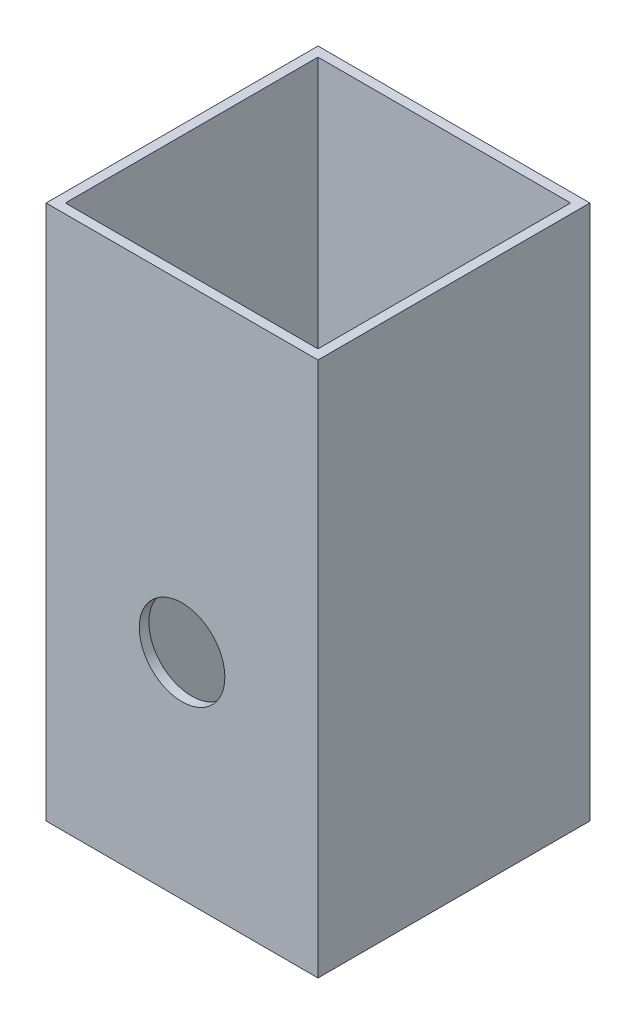
ISO-10303-21;
HEADER;
FILE_DESCRIPTION(('STEP AP214'),'2;1');
FILE_NAME('part.step','',(''),(''),'','','');
FILE_SCHEMA(('AUTOMOTIVE_DESIGN { 1 0 10303 214 1 1 1 1 }'));
ENDSEC;
DATA;
#1=APPLICATION_CONTEXT('core data for automotive mechanical design processes');
#2=APPLICATION_PROTOCOL_DEFINITION('international standard','automotive_design',2000,#1);
#3=PRODUCT_CONTEXT('',#1,'mechanical');
#4=PRODUCT('Part','Part','',(#3));
#5=PRODUCT_RELATED_PRODUCT_CATEGORY('part','',(#4));
#6=PRODUCT_DEFINITION_FORMATION('','',#4);
#7=PRODUCT_DEFINITION_CONTEXT('part definition',#1,'design');
#8=PRODUCT_DEFINITION('design','',#6,#7);
#9=PRODUCT_DEFINITION_SHAPE('','',#8);
#10=(LENGTH_UNIT() NAMED_UNIT(*) SI_UNIT(.MILLI.,.METRE.));
#11=(NAMED_UNIT(*) PLANE_ANGLE_UNIT() SI_UNIT($,.RADIAN.));
#12=(NAMED_UNIT(*) SI_UNIT($,.STERADIAN.) SOLID_ANGLE_UNIT());
#13=UNCERTAINTY_MEASURE_WITH_UNIT(LENGTH_MEASURE(1.E-05),#10,'distance_accuracy_value','');
#14=(GEOMETRIC_REPRESENTATION_CONTEXT(3) GLOBAL_UNCERTAINTY_ASSIGNED_CONTEXT((#13)) GLOBAL_UNIT_ASSIGNED_CONTEXT((#10,
#11,#12)) REPRESENTATION_CONTEXT('',''));
#15=CARTESIAN_POINT('',(0.,0.,0.));
#16=DIRECTION('',(0.,0.,1.));
#17=DIRECTION('',(1.,0.,0.));
#18=AXIS2_PLACEMENT_3D('',#15,#16,#17);
#19=CARTESIAN_POINT('',(0.,50.,0.));
#20=DIRECTION('',(0.,1.,0.));
#21=DIRECTION('',(0.,0.,1.));
#22=AXIS2_PLACEMENT_3D('',#19,#20,#21);
#23=PLANE('',#22);
#24=DIRECTION('',(0.,0.,-1.));
#25=VECTOR('',#24,1.);
#26=CARTESIAN_POINT('',(12.7,50.,-12.7));
#27=LINE('',#26,#25);
#28=CARTESIAN_POINT('',(12.7,50.,12.7));
#29=VERTEX_POINT('',#28);
#30=CARTESIAN_POINT('',(12.7,50.,-12.7));
#31=VERTEX_POINT('',#30);
#32=EDGE_CURVE('E160',#29,#31,#27,.T.);
#33=ORIENTED_EDGE('',*,*,#32,.T.);
#34=DIRECTION('',(-1.,0.,0.));
#35=VECTOR('',#34,1.);
#36=CARTESIAN_POINT('',(-12.7,50.,-12.7));
#37=LINE('',#36,#35);
#38=CARTESIAN_POINT('',(-12.7,50.,-12.7));
#39=VERTEX_POINT('',#38);
#40=EDGE_CURVE('E164',#31,#39,#37,.T.);
#41=ORIENTED_EDGE('',*,*,#40,.T.);
#42=DIRECTION('',(0.,0.,1.));
#43=VECTOR('',#42,1.);
#44=CARTESIAN_POINT('',(-12.7,50.,-12.7));
#45=LINE('',#44,#43);
#46=CARTESIAN_POINT('',(-12.7,50.,12.7));
#47=VERTEX_POINT('',#46);
#48=EDGE_CURVE('E168',#39,#47,#45,.T.);
#49=ORIENTED_EDGE('',*,*,#48,.T.);
#50=DIRECTION('',(1.,0.,0.));
#51=VECTOR('',#50,1.);
#52=CARTESIAN_POINT('',(-12.7,50.,12.7));
#53=LINE('',#52,#51);
#54=EDGE_CURVE('E171',#47,#29,#53,.T.);
#55=ORIENTED_EDGE('',*,*,#54,.T.);
#56=EDGE_LOOP('',(#33,#41,#49,#55));
#57=FACE_BOUND('',#56,.T.);
#58=DIRECTION('',(0.,0.,1.));
#59=VECTOR('',#58,1.);
#60=CARTESIAN_POINT('',(-11.8,50.,-11.8));
#61=LINE('',#60,#59);
#62=CARTESIAN_POINT('',(-11.8,50.,-11.8));
#63=VERTEX_POINT('',#62);
#64=CARTESIAN_POINT('',(-11.8,50.,11.8));
#65=VERTEX_POINT('',#64);
#66=EDGE_CURVE('E119',#63,#65,#61,.T.);
#67=ORIENTED_EDGE('',*,*,#66,.F.);
#68=DIRECTION('',(-1.,0.,0.));
#69=VECTOR('',#68,1.);
#70=CARTESIAN_POINT('',(-11.8,50.,-11.8));
#71=LINE('',#70,#69);
#72=CARTESIAN_POINT('',(11.8,50.,-11.8));
#73=VERTEX_POINT('',#72);
#74=EDGE_CURVE('E110',#73,#63,#71,.T.);
#75=ORIENTED_EDGE('',*,*,#74,.F.);
#76=DIRECTION('',(0.,0.,-1.));
#77=VECTOR('',#76,1.);
#78=CARTESIAN_POINT('',(11.8,50.,-11.8));
#79=LINE('',#78,#77);
#80=CARTESIAN_POINT('',(11.8,50.,11.8));
#81=VERTEX_POINT('',#80);
#82=EDGE_CURVE('E136',#81,#73,#79,.T.);
#83=ORIENTED_EDGE('',*,*,#82,.F.);
#84=DIRECTION('',(1.,0.,0.));
#85=VECTOR('',#84,1.);
#86=CARTESIAN_POINT('',(-11.8,50.,11.8));
#87=LINE('',#86,#85);
#88=EDGE_CURVE('E132',#65,#81,#87,.T.);
#89=ORIENTED_EDGE('',*,*,#88,.F.);
#90=EDGE_LOOP('',(#67,#75,#83,#89));
#91=FACE_BOUND('',#90,.T.);
#92=ADVANCED_FACE('F43',(#57,#91),#23,.T.);
#93=CARTESIAN_POINT('',(0.,0.,0.));
#94=DIRECTION('',(0.,1.,0.));
#95=DIRECTION('',(0.,0.,1.));
#96=AXIS2_PLACEMENT_3D('',#93,#94,#95);
#97=PLANE('',#96);
#98=DIRECTION('',(0.,0.,-1.));
#99=VECTOR('',#98,1.);
#100=CARTESIAN_POINT('',(12.7,0.,-12.7));
#101=LINE('',#100,#99);
#102=CARTESIAN_POINT('',(12.7,0.,12.7));
#103=VERTEX_POINT('',#102);
#104=CARTESIAN_POINT('',(12.7,0.,-12.7));
#105=VERTEX_POINT('',#104);
#106=EDGE_CURVE('E128',#103,#105,#101,.T.);
#107=ORIENTED_EDGE('',*,*,#106,.F.);
#108=DIRECTION('',(1.,0.,0.));
#109=VECTOR('',#108,1.);
#110=CARTESIAN_POINT('',(-12.7,0.,12.7));
#111=LINE('',#110,#109);
#112=CARTESIAN_POINT('',(-12.7,0.,12.7));
#113=VERTEX_POINT('',#112);
#114=EDGE_CURVE('E165',#113,#103,#111,.T.);
#115=ORIENTED_EDGE('',*,*,#114,.F.);
#116=DIRECTION('',(0.,0.,1.));
#117=VECTOR('',#116,1.);
#118=CARTESIAN_POINT('',(-12.7,0.,-12.7));
#119=LINE('',#118,#117);
#120=CARTESIAN_POINT('',(-12.7,0.,-12.7));
#121=VERTEX_POINT('',#120);
#122=EDGE_CURVE('E181',#121,#113,#119,.T.);
#123=ORIENTED_EDGE('',*,*,#122,.F.);
#124=DIRECTION('',(-1.,0.,0.));
#125=VECTOR('',#124,1.);
#126=CARTESIAN_POINT('',(-12.7,0.,-12.7));
#127=LINE('',#126,#125);
#128=EDGE_CURVE('E178',#105,#121,#127,.T.);
#129=ORIENTED_EDGE('',*,*,#128,.F.);
#130=EDGE_LOOP('',(#107,#115,#123,#129));
#131=FACE_BOUND('',#130,.T.);
#132=DIRECTION('',(-1.,0.,0.));
#133=VECTOR('',#132,1.);
#134=CARTESIAN_POINT('',(-11.8,0.,-11.8));
#135=LINE('',#134,#133);
#136=CARTESIAN_POINT('',(11.8,0.,-11.8));
#137=VERTEX_POINT('',#136);
#138=CARTESIAN_POINT('',(-11.8,0.,-11.8));
#139=VERTEX_POINT('',#138);
#140=EDGE_CURVE('E68',#137,#139,#135,.T.);
#141=ORIENTED_EDGE('',*,*,#140,.T.);
#142=DIRECTION('',(0.,0.,1.));
#143=VECTOR('',#142,1.);
#144=CARTESIAN_POINT('',(-11.8,0.,-11.8));
#145=LINE('',#144,#143);
#146=CARTESIAN_POINT('',(-11.8,0.,11.8));
#147=VERTEX_POINT('',#146);
#148=EDGE_CURVE('E126',#139,#147,#145,.T.);
#149=ORIENTED_EDGE('',*,*,#148,.T.);
#150=DIRECTION('',(1.,0.,0.));
#151=VECTOR('',#150,1.);
#152=CARTESIAN_POINT('',(-11.8,0.,11.8));
#153=LINE('',#152,#151);
#154=CARTESIAN_POINT('',(11.8,0.,11.8));
#155=VERTEX_POINT('',#154);
#156=EDGE_CURVE('E147',#147,#155,#153,.T.);
#157=ORIENTED_EDGE('',*,*,#156,.T.);
#158=DIRECTION('',(0.,0.,-1.));
#159=VECTOR('',#158,1.);
#160=CARTESIAN_POINT('',(11.8,0.,-11.8));
#161=LINE('',#160,#159);
#162=EDGE_CURVE('E120',#155,#137,#161,.T.);
#163=ORIENTED_EDGE('',*,*,#162,.T.);
#164=EDGE_LOOP('',(#141,#149,#157,#163));
#165=FACE_BOUND('',#164,.T.);
#166=ADVANCED_FACE('F205',(#131,#165),#97,.F.);
#167=CARTESIAN_POINT('',(12.7,50.,-12.7));
#168=DIRECTION('',(-1.,0.,0.));
#169=DIRECTION('',(0.,0.,1.));
#170=AXIS2_PLACEMENT_3D('',#167,#168,#169);
#171=PLANE('',#170);
#172=ORIENTED_EDGE('',*,*,#106,.T.);
#173=DIRECTION('',(0.,-1.,0.));
#174=VECTOR('',#173,1.);
#175=CARTESIAN_POINT('',(12.7,50.,-12.7));
#176=LINE('',#175,#174);
#177=EDGE_CURVE('E11',#31,#105,#176,.T.);
#178=ORIENTED_EDGE('',*,*,#177,.F.);
#179=ORIENTED_EDGE('',*,*,#32,.F.);
#180=DIRECTION('',(0.,-1.,0.));
#181=VECTOR('',#180,1.);
#182=CARTESIAN_POINT('',(12.7,50.,12.7));
#183=LINE('',#182,#181);
#184=EDGE_CURVE('E174',#29,#103,#183,.T.);
#185=ORIENTED_EDGE('',*,*,#184,.T.);
#186=EDGE_LOOP('',(#172,#178,#179,#185));
#187=FACE_BOUND('',#186,.T.);
#188=ADVANCED_FACE('F45',(#187),#171,.F.);
#189=CARTESIAN_POINT('',(-12.7,50.,-12.7));
#190=DIRECTION('',(0.,0.,1.));
#191=DIRECTION('',(1.,0.,0.));
#192=AXIS2_PLACEMENT_3D('',#189,#190,#191);
#193=PLANE('',#192);
#194=CARTESIAN_POINT('',(0.,20.,-12.7));
#195=DIRECTION('',(0.,0.,1.));
#196=DIRECTION('',(1.,0.,0.));
#197=AXIS2_PLACEMENT_3D('',#194,#195,#196);
#198=CIRCLE('',#197,4.);
#199=CARTESIAN_POINT('',(4.,20.,-12.7));
#200=VERTEX_POINT('',#199);
#201=EDGE_CURVE('E244',#200,#200,#198,.T.);
#202=ORIENTED_EDGE('',*,*,#201,.T.);
#203=EDGE_LOOP('',(#202));
#204=FACE_BOUND('',#203,.T.);
#205=ORIENTED_EDGE('',*,*,#128,.T.);
#206=DIRECTION('',(0.,-1.,0.));
#207=VECTOR('',#206,1.);
#208=CARTESIAN_POINT('',(-12.7,50.,-12.7));
#209=LINE('',#208,#207);
#210=EDGE_CURVE('E53',#39,#121,#209,.T.);
#211=ORIENTED_EDGE('',*,*,#210,.F.);
#212=ORIENTED_EDGE('',*,*,#40,.F.);
#213=ORIENTED_EDGE('',*,*,#177,.T.);
#214=EDGE_LOOP('',(#205,#211,#212,#213));
#215=FACE_BOUND('',#214,.T.);
#216=ADVANCED_FACE('F215',(#204,#215),#193,.F.);
#217=CARTESIAN_POINT('',(-12.7,50.,-12.7));
#218=DIRECTION('',(1.,0.,0.));
#219=DIRECTION('',(0.,0.,-1.));
#220=AXIS2_PLACEMENT_3D('',#217,#218,#219);
#221=PLANE('',#220);
#222=ORIENTED_EDGE('',*,*,#122,.T.);
#223=DIRECTION('',(0.,-1.,0.));
#224=VECTOR('',#223,1.);
#225=CARTESIAN_POINT('',(-12.7,50.,12.7));
#226=LINE('',#225,#224);
#227=EDGE_CURVE('E189',#47,#113,#226,.T.);
#228=ORIENTED_EDGE('',*,*,#227,.F.);
#229=ORIENTED_EDGE('',*,*,#48,.F.);
#230=ORIENTED_EDGE('',*,*,#210,.T.);
#231=EDGE_LOOP('',(#222,#228,#229,#230));
#232=FACE_BOUND('',#231,.T.);
#233=ADVANCED_FACE('F199',(#232),#221,.F.);
#234=CARTESIAN_POINT('',(-12.7,50.,12.7));
#235=DIRECTION('',(0.,0.,-1.));
#236=DIRECTION('',(-1.,0.,0.));
#237=AXIS2_PLACEMENT_3D('',#234,#235,#236);
#238=PLANE('',#237);
#239=CARTESIAN_POINT('',(0.,20.,12.7));
#240=DIRECTION('',(0.,0.,1.));
#241=DIRECTION('',(1.,0.,0.));
#242=AXIS2_PLACEMENT_3D('',#239,#240,#241);
#243=CIRCLE('',#242,4.);
#244=CARTESIAN_POINT('',(4.,20.,12.7));
#245=VERTEX_POINT('',#244);
#246=EDGE_CURVE('E241',#245,#245,#243,.T.);
#247=ORIENTED_EDGE('',*,*,#246,.F.);
#248=EDGE_LOOP('',(#247));
#249=FACE_BOUND('',#248,.T.);
#250=ORIENTED_EDGE('',*,*,#114,.T.);
#251=ORIENTED_EDGE('',*,*,#184,.F.);
#252=ORIENTED_EDGE('',*,*,#54,.F.);
#253=ORIENTED_EDGE('',*,*,#227,.T.);
#254=EDGE_LOOP('',(#250,#251,#252,#253));
#255=FACE_BOUND('',#254,.T.);
#256=ADVANCED_FACE('F209',(#249,#255),#238,.F.);
#257=CARTESIAN_POINT('',(-11.8,50.,-11.8));
#258=DIRECTION('',(0.,0.,1.));
#259=DIRECTION('',(1.,0.,0.));
#260=AXIS2_PLACEMENT_3D('',#257,#258,#259);
#261=PLANE('',#260);
#262=CARTESIAN_POINT('',(0.,20.,-11.8));
#263=DIRECTION('',(0.,0.,1.));
#264=DIRECTION('',(1.,0.,0.));
#265=AXIS2_PLACEMENT_3D('',#262,#263,#264);
#266=CIRCLE('',#265,4.);
#267=CARTESIAN_POINT('',(4.,20.,-11.8));
#268=VERTEX_POINT('',#267);
#269=EDGE_CURVE('E144',#268,#268,#266,.T.);
#270=ORIENTED_EDGE('',*,*,#269,.F.);
#271=EDGE_LOOP('',(#270));
#272=FACE_BOUND('',#271,.T.);
#273=ORIENTED_EDGE('',*,*,#140,.F.);
#274=DIRECTION('',(0.,-1.,0.));
#275=VECTOR('',#274,1.);
#276=CARTESIAN_POINT('',(11.8,50.,-11.8));
#277=LINE('',#276,#275);
#278=EDGE_CURVE('E114',#73,#137,#277,.T.);
#279=ORIENTED_EDGE('',*,*,#278,.F.);
#280=ORIENTED_EDGE('',*,*,#74,.T.);
#281=DIRECTION('',(0.,-1.,0.));
#282=VECTOR('',#281,1.);
#283=CARTESIAN_POINT('',(-11.8,50.,-11.8));
#284=LINE('',#283,#282);
#285=EDGE_CURVE('E113',#63,#139,#284,.T.);
#286=ORIENTED_EDGE('',*,*,#285,.T.);
#287=EDGE_LOOP('',(#273,#279,#280,#286));
#288=FACE_BOUND('',#287,.T.);
#289=ADVANCED_FACE('F112',(#272,#288),#261,.T.);
#290=CARTESIAN_POINT('',(-11.8,50.,-11.8));
#291=DIRECTION('',(1.,0.,0.));
#292=DIRECTION('',(0.,0.,-1.));
#293=AXIS2_PLACEMENT_3D('',#290,#291,#292);
#294=PLANE('',#293);
#295=ORIENTED_EDGE('',*,*,#148,.F.);
#296=ORIENTED_EDGE('',*,*,#285,.F.);
#297=ORIENTED_EDGE('',*,*,#66,.T.);
#298=DIRECTION('',(0.,-1.,0.));
#299=VECTOR('',#298,1.);
#300=CARTESIAN_POINT('',(-11.8,50.,11.8));
#301=LINE('',#300,#299);
#302=EDGE_CURVE('E129',#65,#147,#301,.T.);
#303=ORIENTED_EDGE('',*,*,#302,.T.);
#304=EDGE_LOOP('',(#295,#296,#297,#303));
#305=FACE_BOUND('',#304,.T.);
#306=ADVANCED_FACE('F123',(#305),#294,.T.);
#307=CARTESIAN_POINT('',(-11.8,50.,11.8));
#308=DIRECTION('',(0.,0.,-1.));
#309=DIRECTION('',(-1.,0.,0.));
#310=AXIS2_PLACEMENT_3D('',#307,#308,#309);
#311=PLANE('',#310);
#312=CARTESIAN_POINT('',(0.,20.,11.8));
#313=DIRECTION('',(0.,0.,-1.));
#314=DIRECTION('',(-1.,0.,0.));
#315=AXIS2_PLACEMENT_3D('',#312,#313,#314);
#316=CIRCLE('',#315,4.);
#317=CARTESIAN_POINT('',(-4.,20.,11.8));
#318=VERTEX_POINT('',#317);
#319=EDGE_CURVE('E47',#318,#318,#316,.T.);
#320=ORIENTED_EDGE('',*,*,#319,.F.);
#321=EDGE_LOOP('',(#320));
#322=FACE_BOUND('',#321,.T.);
#323=ORIENTED_EDGE('',*,*,#156,.F.);
#324=ORIENTED_EDGE('',*,*,#302,.F.);
#325=ORIENTED_EDGE('',*,*,#88,.T.);
#326=DIRECTION('',(0.,-1.,0.));
#327=VECTOR('',#326,1.);
#328=CARTESIAN_POINT('',(11.8,50.,11.8));
#329=LINE('',#328,#327);
#330=EDGE_CURVE('E60',#81,#155,#329,.T.);
#331=ORIENTED_EDGE('',*,*,#330,.T.);
#332=EDGE_LOOP('',(#323,#324,#325,#331));
#333=FACE_BOUND('',#332,.T.);
#334=ADVANCED_FACE('F258',(#322,#333),#311,.T.);
#335=CARTESIAN_POINT('',(11.8,50.,-11.8));
#336=DIRECTION('',(-1.,0.,0.));
#337=DIRECTION('',(0.,0.,1.));
#338=AXIS2_PLACEMENT_3D('',#335,#336,#337);
#339=PLANE('',#338);
#340=ORIENTED_EDGE('',*,*,#162,.F.);
#341=ORIENTED_EDGE('',*,*,#330,.F.);
#342=ORIENTED_EDGE('',*,*,#82,.T.);
#343=ORIENTED_EDGE('',*,*,#278,.T.);
#344=EDGE_LOOP('',(#340,#341,#342,#343));
#345=FACE_BOUND('',#344,.T.);
#346=ADVANCED_FACE('F261',(#345),#339,.T.);
#347=CARTESIAN_POINT('',(0.,20.,-12.7));
#348=DIRECTION('',(0.,0.,1.));
#349=DIRECTION('',(1.,0.,0.));
#350=AXIS2_PLACEMENT_3D('',#347,#348,#349);
#351=CYLINDRICAL_SURFACE('',#350,4.);
#352=ORIENTED_EDGE('',*,*,#319,.T.);
#353=EDGE_LOOP('',(#352));
#354=FACE_BOUND('',#353,.T.);
#355=ORIENTED_EDGE('',*,*,#246,.T.);
#356=EDGE_LOOP('',(#355));
#357=FACE_BOUND('',#356,.T.);
#358=ADVANCED_FACE('F256',(#354,#357),#351,.F.);
#359=ORIENTED_EDGE('',*,*,#269,.T.);
#360=EDGE_LOOP('',(#359));
#361=FACE_BOUND('',#360,.T.);
#362=ORIENTED_EDGE('',*,*,#201,.F.);
#363=EDGE_LOOP('',(#362));
#364=FACE_BOUND('',#363,.T.);
#365=ADVANCED_FACE('F269',(#361,#364),#351,.F.);
#366=CLOSED_SHELL('',(#92,#166,#188,#216,#233,#256,#289,#306,#334,#346,#358,#365));
#367=MANIFOLD_SOLID_BREP('B2',#366);
#368=ADVANCED_BREP_SHAPE_REPRESENTATION('',(#18,#367),#14);
#369=SHAPE_DEFINITION_REPRESENTATION(#9,#368);
ENDSEC;
END-ISO-10303-21;
